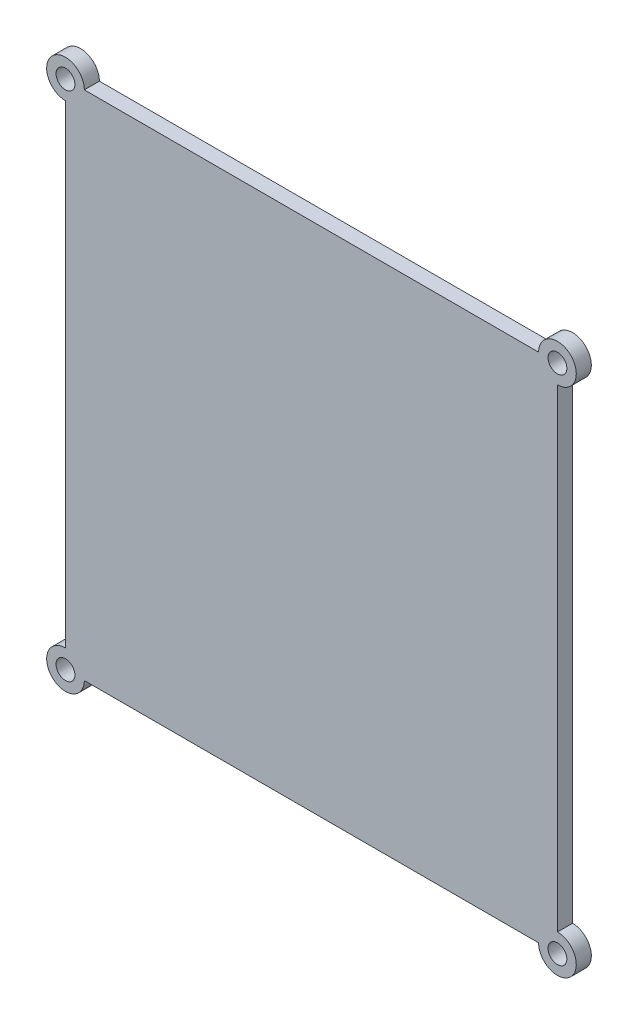
ISO-10303-21;
HEADER;
FILE_DESCRIPTION(('STEP AP214'),'2;1');
FILE_NAME('part.step','',(''),(''),'','','');
FILE_SCHEMA(('AUTOMOTIVE_DESIGN { 1 0 10303 214 1 1 1 1 }'));
ENDSEC;
DATA;
#1=APPLICATION_CONTEXT('core data for automotive mechanical design processes');
#2=APPLICATION_PROTOCOL_DEFINITION('international standard','automotive_design',2000,#1);
#3=PRODUCT_CONTEXT('',#1,'mechanical');
#4=PRODUCT('Part','Part','',(#3));
#5=PRODUCT_RELATED_PRODUCT_CATEGORY('part','',(#4));
#6=PRODUCT_DEFINITION_FORMATION('','',#4);
#7=PRODUCT_DEFINITION_CONTEXT('part definition',#1,'design');
#8=PRODUCT_DEFINITION('design','',#6,#7);
#9=PRODUCT_DEFINITION_SHAPE('','',#8);
#10=(LENGTH_UNIT() NAMED_UNIT(*) SI_UNIT(.MILLI.,.METRE.));
#11=(NAMED_UNIT(*) PLANE_ANGLE_UNIT() SI_UNIT($,.RADIAN.));
#12=(NAMED_UNIT(*) SI_UNIT($,.STERADIAN.) SOLID_ANGLE_UNIT());
#13=UNCERTAINTY_MEASURE_WITH_UNIT(LENGTH_MEASURE(1.E-05),#10,'distance_accuracy_value','');
#14=(GEOMETRIC_REPRESENTATION_CONTEXT(3) GLOBAL_UNCERTAINTY_ASSIGNED_CONTEXT((#13)) GLOBAL_UNIT_ASSIGNED_CONTEXT((#10,
#11,#12)) REPRESENTATION_CONTEXT('',''));
#15=CARTESIAN_POINT('',(0.,0.,0.));
#16=DIRECTION('',(0.,0.,1.));
#17=DIRECTION('',(1.,0.,0.));
#18=AXIS2_PLACEMENT_3D('',#15,#16,#17);
#19=CARTESIAN_POINT('',(32.65,-33.95,2.));
#20=DIRECTION('',(0.,0.,1.));
#21=DIRECTION('',(1.,0.,0.));
#22=AXIS2_PLACEMENT_3D('',#19,#20,#21);
#23=PLANE('',#22);
#24=CARTESIAN_POINT('',(32.65,-33.95,2.));
#25=DIRECTION('',(0.,0.,1.));
#26=DIRECTION('',(1.,0.,0.));
#27=AXIS2_PLACEMENT_3D('',#24,#25,#26);
#28=CIRCLE('',#27,1.25);
#29=CARTESIAN_POINT('',(33.9,-33.95,2.));
#30=VERTEX_POINT('',#29);
#31=EDGE_CURVE('E193',#30,#30,#28,.T.);
#32=ORIENTED_EDGE('',*,*,#31,.F.);
#33=EDGE_LOOP('',(#32));
#34=FACE_BOUND('',#33,.T.);
#35=CARTESIAN_POINT('',(-32.65,33.95,2.));
#36=DIRECTION('',(0.,0.,1.));
#37=DIRECTION('',(1.,0.,0.));
#38=AXIS2_PLACEMENT_3D('',#35,#36,#37);
#39=CIRCLE('',#38,1.25);
#40=CARTESIAN_POINT('',(-31.4,33.95,2.));
#41=VERTEX_POINT('',#40);
#42=EDGE_CURVE('E139',#41,#41,#39,.T.);
#43=ORIENTED_EDGE('',*,*,#42,.F.);
#44=EDGE_LOOP('',(#43));
#45=FACE_BOUND('',#44,.T.);
#46=CARTESIAN_POINT('',(32.65,-33.95,2.));
#47=DIRECTION('',(0.,0.,1.));
#48=DIRECTION('',(1.,0.,0.));
#49=AXIS2_PLACEMENT_3D('',#46,#47,#48);
#50=CIRCLE('',#49,2.5);
#51=CARTESIAN_POINT('',(30.15,-33.95,2.));
#52=VERTEX_POINT('',#51);
#53=CARTESIAN_POINT('',(32.65,-31.45,2.));
#54=VERTEX_POINT('',#53);
#55=EDGE_CURVE('E150',#52,#54,#50,.T.);
#56=ORIENTED_EDGE('',*,*,#55,.T.);
#57=DIRECTION('',(0.,1.,0.));
#58=VECTOR('',#57,1.);
#59=CARTESIAN_POINT('',(32.65,-31.45,2.));
#60=LINE('',#59,#58);
#61=CARTESIAN_POINT('',(32.65,31.45,2.));
#62=VERTEX_POINT('',#61);
#63=EDGE_CURVE('E98',#54,#62,#60,.T.);
#64=ORIENTED_EDGE('',*,*,#63,.T.);
#65=CARTESIAN_POINT('',(32.65,33.95,2.));
#66=DIRECTION('',(0.,0.,1.));
#67=DIRECTION('',(1.,0.,0.));
#68=AXIS2_PLACEMENT_3D('',#65,#66,#67);
#69=CIRCLE('',#68,2.5);
#70=CARTESIAN_POINT('',(30.15,33.95,2.));
#71=VERTEX_POINT('',#70);
#72=EDGE_CURVE('E165',#62,#71,#69,.T.);
#73=ORIENTED_EDGE('',*,*,#72,.T.);
#74=DIRECTION('',(-1.,0.,0.));
#75=VECTOR('',#74,1.);
#76=CARTESIAN_POINT('',(30.15,33.95,2.));
#77=LINE('',#76,#75);
#78=CARTESIAN_POINT('',(-30.15,33.95,2.));
#79=VERTEX_POINT('',#78);
#80=EDGE_CURVE('E178',#71,#79,#77,.T.);
#81=ORIENTED_EDGE('',*,*,#80,.T.);
#82=CARTESIAN_POINT('',(-32.65,33.95,2.));
#83=DIRECTION('',(0.,0.,1.));
#84=DIRECTION('',(1.,0.,0.));
#85=AXIS2_PLACEMENT_3D('',#82,#83,#84);
#86=CIRCLE('',#85,2.5);
#87=CARTESIAN_POINT('',(-32.65,31.45,2.));
#88=VERTEX_POINT('',#87);
#89=EDGE_CURVE('E117',#79,#88,#86,.T.);
#90=ORIENTED_EDGE('',*,*,#89,.T.);
#91=DIRECTION('',(0.,-1.,0.));
#92=VECTOR('',#91,1.);
#93=CARTESIAN_POINT('',(-32.65,-31.45,2.));
#94=LINE('',#93,#92);
#95=CARTESIAN_POINT('',(-32.65,-31.45,2.));
#96=VERTEX_POINT('',#95);
#97=EDGE_CURVE('E111',#88,#96,#94,.T.);
#98=ORIENTED_EDGE('',*,*,#97,.T.);
#99=CARTESIAN_POINT('',(-32.65,-33.95,2.));
#100=DIRECTION('',(0.,0.,1.));
#101=DIRECTION('',(1.,0.,0.));
#102=AXIS2_PLACEMENT_3D('',#99,#100,#101);
#103=CIRCLE('',#102,2.5);
#104=CARTESIAN_POINT('',(-30.15,-33.95,2.));
#105=VERTEX_POINT('',#104);
#106=EDGE_CURVE('E115',#96,#105,#103,.T.);
#107=ORIENTED_EDGE('',*,*,#106,.T.);
#108=DIRECTION('',(1.,0.,0.));
#109=VECTOR('',#108,1.);
#110=CARTESIAN_POINT('',(30.15,-33.95,2.));
#111=LINE('',#110,#109);
#112=EDGE_CURVE('E55',#105,#52,#111,.T.);
#113=ORIENTED_EDGE('',*,*,#112,.T.);
#114=EDGE_LOOP('',(#56,#64,#73,#81,#90,#98,#107,#113));
#115=FACE_BOUND('',#114,.T.);
#116=CARTESIAN_POINT('',(32.65,33.95,2.));
#117=DIRECTION('',(0.,0.,1.));
#118=DIRECTION('',(1.,0.,0.));
#119=AXIS2_PLACEMENT_3D('',#116,#117,#118);
#120=CIRCLE('',#119,1.25);
#121=CARTESIAN_POINT('',(33.9,33.95,2.));
#122=VERTEX_POINT('',#121);
#123=EDGE_CURVE('E187',#122,#122,#120,.T.);
#124=ORIENTED_EDGE('',*,*,#123,.F.);
#125=EDGE_LOOP('',(#124));
#126=FACE_BOUND('',#125,.T.);
#127=CARTESIAN_POINT('',(-32.65,-33.95,2.));
#128=DIRECTION('',(0.,0.,1.));
#129=DIRECTION('',(1.,0.,0.));
#130=AXIS2_PLACEMENT_3D('',#127,#128,#129);
#131=CIRCLE('',#130,1.25);
#132=CARTESIAN_POINT('',(-31.4,-33.95,2.));
#133=VERTEX_POINT('',#132);
#134=EDGE_CURVE('E199',#133,#133,#131,.T.);
#135=ORIENTED_EDGE('',*,*,#134,.F.);
#136=EDGE_LOOP('',(#135));
#137=FACE_BOUND('',#136,.T.);
#138=ADVANCED_FACE('F38',(#34,#45,#115,#126,#137),#23,.T.);
#139=CARTESIAN_POINT('',(32.65,-33.95,0.));
#140=DIRECTION('',(0.,0.,1.));
#141=DIRECTION('',(1.,0.,0.));
#142=AXIS2_PLACEMENT_3D('',#139,#140,#141);
#143=PLANE('',#142);
#144=CARTESIAN_POINT('',(32.65,-33.95,0.));
#145=DIRECTION('',(0.,0.,1.));
#146=DIRECTION('',(1.,0.,0.));
#147=AXIS2_PLACEMENT_3D('',#144,#145,#146);
#148=CIRCLE('',#147,2.5);
#149=CARTESIAN_POINT('',(30.15,-33.95,0.));
#150=VERTEX_POINT('',#149);
#151=CARTESIAN_POINT('',(32.65,-31.45,0.));
#152=VERTEX_POINT('',#151);
#153=EDGE_CURVE('E135',#150,#152,#148,.T.);
#154=ORIENTED_EDGE('',*,*,#153,.F.);
#155=DIRECTION('',(1.,0.,0.));
#156=VECTOR('',#155,1.);
#157=CARTESIAN_POINT('',(30.15,-33.95,0.));
#158=LINE('',#157,#156);
#159=CARTESIAN_POINT('',(-30.15,-33.95,0.));
#160=VERTEX_POINT('',#159);
#161=EDGE_CURVE('E90',#160,#150,#158,.T.);
#162=ORIENTED_EDGE('',*,*,#161,.F.);
#163=CARTESIAN_POINT('',(-32.65,-33.95,0.));
#164=DIRECTION('',(0.,0.,1.));
#165=DIRECTION('',(1.,0.,0.));
#166=AXIS2_PLACEMENT_3D('',#163,#164,#165);
#167=CIRCLE('',#166,2.5);
#168=CARTESIAN_POINT('',(-32.65,-31.45,0.));
#169=VERTEX_POINT('',#168);
#170=EDGE_CURVE('E84',#169,#160,#167,.T.);
#171=ORIENTED_EDGE('',*,*,#170,.F.);
#172=DIRECTION('',(0.,-1.,0.));
#173=VECTOR('',#172,1.);
#174=CARTESIAN_POINT('',(-32.65,-31.45,0.));
#175=LINE('',#174,#173);
#176=CARTESIAN_POINT('',(-32.65,31.45,0.));
#177=VERTEX_POINT('',#176);
#178=EDGE_CURVE('E125',#177,#169,#175,.T.);
#179=ORIENTED_EDGE('',*,*,#178,.F.);
#180=CARTESIAN_POINT('',(-32.65,33.95,0.));
#181=DIRECTION('',(0.,0.,1.));
#182=DIRECTION('',(1.,0.,0.));
#183=AXIS2_PLACEMENT_3D('',#180,#181,#182);
#184=CIRCLE('',#183,2.5);
#185=CARTESIAN_POINT('',(-30.15,33.95,0.));
#186=VERTEX_POINT('',#185);
#187=EDGE_CURVE('E145',#186,#177,#184,.T.);
#188=ORIENTED_EDGE('',*,*,#187,.F.);
#189=DIRECTION('',(-1.,0.,0.));
#190=VECTOR('',#189,1.);
#191=CARTESIAN_POINT('',(30.15,33.95,0.));
#192=LINE('',#191,#190);
#193=CARTESIAN_POINT('',(30.15,33.95,0.));
#194=VERTEX_POINT('',#193);
#195=EDGE_CURVE('E143',#194,#186,#192,.T.);
#196=ORIENTED_EDGE('',*,*,#195,.F.);
#197=CARTESIAN_POINT('',(32.65,33.95,0.));
#198=DIRECTION('',(0.,0.,1.));
#199=DIRECTION('',(1.,0.,0.));
#200=AXIS2_PLACEMENT_3D('',#197,#198,#199);
#201=CIRCLE('',#200,2.5);
#202=CARTESIAN_POINT('',(32.65,31.45,0.));
#203=VERTEX_POINT('',#202);
#204=EDGE_CURVE('E141',#203,#194,#201,.T.);
#205=ORIENTED_EDGE('',*,*,#204,.F.);
#206=DIRECTION('',(0.,1.,0.));
#207=VECTOR('',#206,1.);
#208=CARTESIAN_POINT('',(32.65,-31.45,0.));
#209=LINE('',#208,#207);
#210=EDGE_CURVE('E138',#152,#203,#209,.T.);
#211=ORIENTED_EDGE('',*,*,#210,.F.);
#212=EDGE_LOOP('',(#154,#162,#171,#179,#188,#196,#205,#211));
#213=FACE_BOUND('',#212,.T.);
#214=CARTESIAN_POINT('',(-32.65,33.95,0.));
#215=DIRECTION('',(0.,0.,1.));
#216=DIRECTION('',(1.,0.,0.));
#217=AXIS2_PLACEMENT_3D('',#214,#215,#216);
#218=CIRCLE('',#217,1.25);
#219=CARTESIAN_POINT('',(-31.4,33.95,0.));
#220=VERTEX_POINT('',#219);
#221=EDGE_CURVE('E184',#220,#220,#218,.T.);
#222=ORIENTED_EDGE('',*,*,#221,.T.);
#223=EDGE_LOOP('',(#222));
#224=FACE_BOUND('',#223,.T.);
#225=CARTESIAN_POINT('',(32.65,33.95,0.));
#226=DIRECTION('',(0.,0.,1.));
#227=DIRECTION('',(1.,0.,0.));
#228=AXIS2_PLACEMENT_3D('',#225,#226,#227);
#229=CIRCLE('',#228,1.25);
#230=CARTESIAN_POINT('',(33.9,33.95,0.));
#231=VERTEX_POINT('',#230);
#232=EDGE_CURVE('E190',#231,#231,#229,.T.);
#233=ORIENTED_EDGE('',*,*,#232,.T.);
#234=EDGE_LOOP('',(#233));
#235=FACE_BOUND('',#234,.T.);
#236=CARTESIAN_POINT('',(32.65,-33.95,0.));
#237=DIRECTION('',(0.,0.,1.));
#238=DIRECTION('',(1.,0.,0.));
#239=AXIS2_PLACEMENT_3D('',#236,#237,#238);
#240=CIRCLE('',#239,1.25);
#241=CARTESIAN_POINT('',(33.9,-33.95,0.));
#242=VERTEX_POINT('',#241);
#243=EDGE_CURVE('E196',#242,#242,#240,.T.);
#244=ORIENTED_EDGE('',*,*,#243,.T.);
#245=EDGE_LOOP('',(#244));
#246=FACE_BOUND('',#245,.T.);
#247=CARTESIAN_POINT('',(-32.65,-33.95,0.));
#248=DIRECTION('',(0.,0.,1.));
#249=DIRECTION('',(1.,0.,0.));
#250=AXIS2_PLACEMENT_3D('',#247,#248,#249);
#251=CIRCLE('',#250,1.25);
#252=CARTESIAN_POINT('',(-31.4,-33.95,0.));
#253=VERTEX_POINT('',#252);
#254=EDGE_CURVE('E202',#253,#253,#251,.T.);
#255=ORIENTED_EDGE('',*,*,#254,.T.);
#256=EDGE_LOOP('',(#255));
#257=FACE_BOUND('',#256,.T.);
#258=ADVANCED_FACE('F169',(#213,#224,#235,#246,#257),#143,.F.);
#259=CARTESIAN_POINT('',(32.65,-33.95,2.));
#260=DIRECTION('',(0.,0.,-1.));
#261=DIRECTION('',(-1.,0.,0.));
#262=AXIS2_PLACEMENT_3D('',#259,#260,#261);
#263=CYLINDRICAL_SURFACE('',#262,2.5);
#264=ORIENTED_EDGE('',*,*,#153,.T.);
#265=DIRECTION('',(0.,0.,-1.));
#266=VECTOR('',#265,1.);
#267=CARTESIAN_POINT('',(32.65,-31.45,2.));
#268=LINE('',#267,#266);
#269=EDGE_CURVE('E11',#54,#152,#268,.T.);
#270=ORIENTED_EDGE('',*,*,#269,.F.);
#271=ORIENTED_EDGE('',*,*,#55,.F.);
#272=DIRECTION('',(0.,0.,-1.));
#273=VECTOR('',#272,1.);
#274=CARTESIAN_POINT('',(30.15,-33.95,2.));
#275=LINE('',#274,#273);
#276=EDGE_CURVE('E131',#52,#150,#275,.T.);
#277=ORIENTED_EDGE('',*,*,#276,.T.);
#278=EDGE_LOOP('',(#264,#270,#271,#277));
#279=FACE_BOUND('',#278,.T.);
#280=ADVANCED_FACE('F40',(#279),#263,.T.);
#281=CARTESIAN_POINT('',(32.65,-31.45,2.));
#282=DIRECTION('',(-1.,0.,0.));
#283=DIRECTION('',(0.,0.,1.));
#284=AXIS2_PLACEMENT_3D('',#281,#282,#283);
#285=PLANE('',#284);
#286=ORIENTED_EDGE('',*,*,#210,.T.);
#287=DIRECTION('',(0.,0.,-1.));
#288=VECTOR('',#287,1.);
#289=CARTESIAN_POINT('',(32.65,31.45,2.));
#290=LINE('',#289,#288);
#291=EDGE_CURVE('E47',#62,#203,#290,.T.);
#292=ORIENTED_EDGE('',*,*,#291,.F.);
#293=ORIENTED_EDGE('',*,*,#63,.F.);
#294=ORIENTED_EDGE('',*,*,#269,.T.);
#295=EDGE_LOOP('',(#286,#292,#293,#294));
#296=FACE_BOUND('',#295,.T.);
#297=ADVANCED_FACE('F236',(#296),#285,.F.);
#298=CARTESIAN_POINT('',(32.65,33.95,2.));
#299=DIRECTION('',(0.,0.,-1.));
#300=DIRECTION('',(-1.,0.,0.));
#301=AXIS2_PLACEMENT_3D('',#298,#299,#300);
#302=CYLINDRICAL_SURFACE('',#301,2.5);
#303=ORIENTED_EDGE('',*,*,#204,.T.);
#304=DIRECTION('',(0.,0.,-1.));
#305=VECTOR('',#304,1.);
#306=CARTESIAN_POINT('',(30.15,33.95,2.));
#307=LINE('',#306,#305);
#308=EDGE_CURVE('E157',#71,#194,#307,.T.);
#309=ORIENTED_EDGE('',*,*,#308,.F.);
#310=ORIENTED_EDGE('',*,*,#72,.F.);
#311=ORIENTED_EDGE('',*,*,#291,.T.);
#312=EDGE_LOOP('',(#303,#309,#310,#311));
#313=FACE_BOUND('',#312,.T.);
#314=ADVANCED_FACE('F163',(#313),#302,.T.);
#315=CARTESIAN_POINT('',(30.15,33.95,2.));
#316=DIRECTION('',(0.,-1.,0.));
#317=DIRECTION('',(0.,0.,-1.));
#318=AXIS2_PLACEMENT_3D('',#315,#316,#317);
#319=PLANE('',#318);
#320=ORIENTED_EDGE('',*,*,#195,.T.);
#321=DIRECTION('',(0.,0.,-1.));
#322=VECTOR('',#321,1.);
#323=CARTESIAN_POINT('',(-30.15,33.95,2.));
#324=LINE('',#323,#322);
#325=EDGE_CURVE('E154',#79,#186,#324,.T.);
#326=ORIENTED_EDGE('',*,*,#325,.F.);
#327=ORIENTED_EDGE('',*,*,#80,.F.);
#328=ORIENTED_EDGE('',*,*,#308,.T.);
#329=EDGE_LOOP('',(#320,#326,#327,#328));
#330=FACE_BOUND('',#329,.T.);
#331=ADVANCED_FACE('F174',(#330),#319,.F.);
#332=CARTESIAN_POINT('',(-32.65,33.95,2.));
#333=DIRECTION('',(0.,0.,-1.));
#334=DIRECTION('',(-1.,0.,0.));
#335=AXIS2_PLACEMENT_3D('',#332,#333,#334);
#336=CYLINDRICAL_SURFACE('',#335,2.5);
#337=ORIENTED_EDGE('',*,*,#187,.T.);
#338=DIRECTION('',(0.,0.,-1.));
#339=VECTOR('',#338,1.);
#340=CARTESIAN_POINT('',(-32.65,31.45,2.));
#341=LINE('',#340,#339);
#342=EDGE_CURVE('E126',#88,#177,#341,.T.);
#343=ORIENTED_EDGE('',*,*,#342,.F.);
#344=ORIENTED_EDGE('',*,*,#89,.F.);
#345=ORIENTED_EDGE('',*,*,#325,.T.);
#346=EDGE_LOOP('',(#337,#343,#344,#345));
#347=FACE_BOUND('',#346,.T.);
#348=ADVANCED_FACE('F177',(#347),#336,.T.);
#349=CARTESIAN_POINT('',(-32.65,-31.45,2.));
#350=DIRECTION('',(1.,0.,0.));
#351=DIRECTION('',(0.,1.,0.));
#352=AXIS2_PLACEMENT_3D('',#349,#350,#351);
#353=PLANE('',#352);
#354=ORIENTED_EDGE('',*,*,#178,.T.);
#355=DIRECTION('',(0.,0.,-1.));
#356=VECTOR('',#355,1.);
#357=CARTESIAN_POINT('',(-32.65,-31.45,2.));
#358=LINE('',#357,#356);
#359=EDGE_CURVE('E122',#96,#169,#358,.T.);
#360=ORIENTED_EDGE('',*,*,#359,.F.);
#361=ORIENTED_EDGE('',*,*,#97,.F.);
#362=ORIENTED_EDGE('',*,*,#342,.T.);
#363=EDGE_LOOP('',(#354,#360,#361,#362));
#364=FACE_BOUND('',#363,.T.);
#365=ADVANCED_FACE('F123',(#364),#353,.F.);
#366=CARTESIAN_POINT('',(-32.65,-33.95,2.));
#367=DIRECTION('',(0.,0.,-1.));
#368=DIRECTION('',(-1.,0.,0.));
#369=AXIS2_PLACEMENT_3D('',#366,#367,#368);
#370=CYLINDRICAL_SURFACE('',#369,2.5);
#371=ORIENTED_EDGE('',*,*,#170,.T.);
#372=DIRECTION('',(0.,0.,-1.));
#373=VECTOR('',#372,1.);
#374=CARTESIAN_POINT('',(-30.15,-33.95,2.));
#375=LINE('',#374,#373);
#376=EDGE_CURVE('E127',#105,#160,#375,.T.);
#377=ORIENTED_EDGE('',*,*,#376,.F.);
#378=ORIENTED_EDGE('',*,*,#106,.F.);
#379=ORIENTED_EDGE('',*,*,#359,.T.);
#380=EDGE_LOOP('',(#371,#377,#378,#379));
#381=FACE_BOUND('',#380,.T.);
#382=ADVANCED_FACE('F129',(#381),#370,.T.);
#383=CARTESIAN_POINT('',(30.15,-33.95,2.));
#384=DIRECTION('',(0.,1.,0.));
#385=DIRECTION('',(0.,0.,1.));
#386=AXIS2_PLACEMENT_3D('',#383,#384,#385);
#387=PLANE('',#386);
#388=ORIENTED_EDGE('',*,*,#161,.T.);
#389=ORIENTED_EDGE('',*,*,#276,.F.);
#390=ORIENTED_EDGE('',*,*,#112,.F.);
#391=ORIENTED_EDGE('',*,*,#376,.T.);
#392=EDGE_LOOP('',(#388,#389,#390,#391));
#393=FACE_BOUND('',#392,.T.);
#394=ADVANCED_FACE('F224',(#393),#387,.F.);
#395=CARTESIAN_POINT('',(-32.65,33.95,2.));
#396=DIRECTION('',(0.,0.,-1.));
#397=DIRECTION('',(-1.,0.,0.));
#398=AXIS2_PLACEMENT_3D('',#395,#396,#397);
#399=CYLINDRICAL_SURFACE('',#398,1.25);
#400=ORIENTED_EDGE('',*,*,#42,.T.);
#401=EDGE_LOOP('',(#400));
#402=FACE_BOUND('',#401,.T.);
#403=ORIENTED_EDGE('',*,*,#221,.F.);
#404=EDGE_LOOP('',(#403));
#405=FACE_BOUND('',#404,.T.);
#406=ADVANCED_FACE('F221',(#402,#405),#399,.F.);
#407=CARTESIAN_POINT('',(32.65,33.95,2.));
#408=DIRECTION('',(0.,0.,-1.));
#409=DIRECTION('',(-1.,0.,0.));
#410=AXIS2_PLACEMENT_3D('',#407,#408,#409);
#411=CYLINDRICAL_SURFACE('',#410,1.25);
#412=ORIENTED_EDGE('',*,*,#123,.T.);
#413=EDGE_LOOP('',(#412));
#414=FACE_BOUND('',#413,.T.);
#415=ORIENTED_EDGE('',*,*,#232,.F.);
#416=EDGE_LOOP('',(#415));
#417=FACE_BOUND('',#416,.T.);
#418=ADVANCED_FACE('F312',(#414,#417),#411,.F.);
#419=CARTESIAN_POINT('',(32.65,-33.95,2.));
#420=DIRECTION('',(0.,0.,-1.));
#421=DIRECTION('',(-1.,0.,0.));
#422=AXIS2_PLACEMENT_3D('',#419,#420,#421);
#423=CYLINDRICAL_SURFACE('',#422,1.25);
#424=ORIENTED_EDGE('',*,*,#31,.T.);
#425=EDGE_LOOP('',(#424));
#426=FACE_BOUND('',#425,.T.);
#427=ORIENTED_EDGE('',*,*,#243,.F.);
#428=EDGE_LOOP('',(#427));
#429=FACE_BOUND('',#428,.T.);
#430=ADVANCED_FACE('F321',(#426,#429),#423,.F.);
#431=CARTESIAN_POINT('',(-32.65,-33.95,2.));
#432=DIRECTION('',(0.,0.,-1.));
#433=DIRECTION('',(-1.,0.,0.));
#434=AXIS2_PLACEMENT_3D('',#431,#432,#433);
#435=CYLINDRICAL_SURFACE('',#434,1.25);
#436=ORIENTED_EDGE('',*,*,#134,.T.);
#437=EDGE_LOOP('',(#436));
#438=FACE_BOUND('',#437,.T.);
#439=ORIENTED_EDGE('',*,*,#254,.F.);
#440=EDGE_LOOP('',(#439));
#441=FACE_BOUND('',#440,.T.);
#442=ADVANCED_FACE('F208',(#438,#441),#435,.F.);
#443=CLOSED_SHELL('',(#138,#258,#280,#297,#314,#331,#348,#365,#382,#394,#406,#418,#430,#442));
#444=MANIFOLD_SOLID_BREP('B2',#443);
#445=ADVANCED_BREP_SHAPE_REPRESENTATION('',(#18,#444),#14);
#446=SHAPE_DEFINITION_REPRESENTATION(#9,#445);
ENDSEC;
END-ISO-10303-21;
